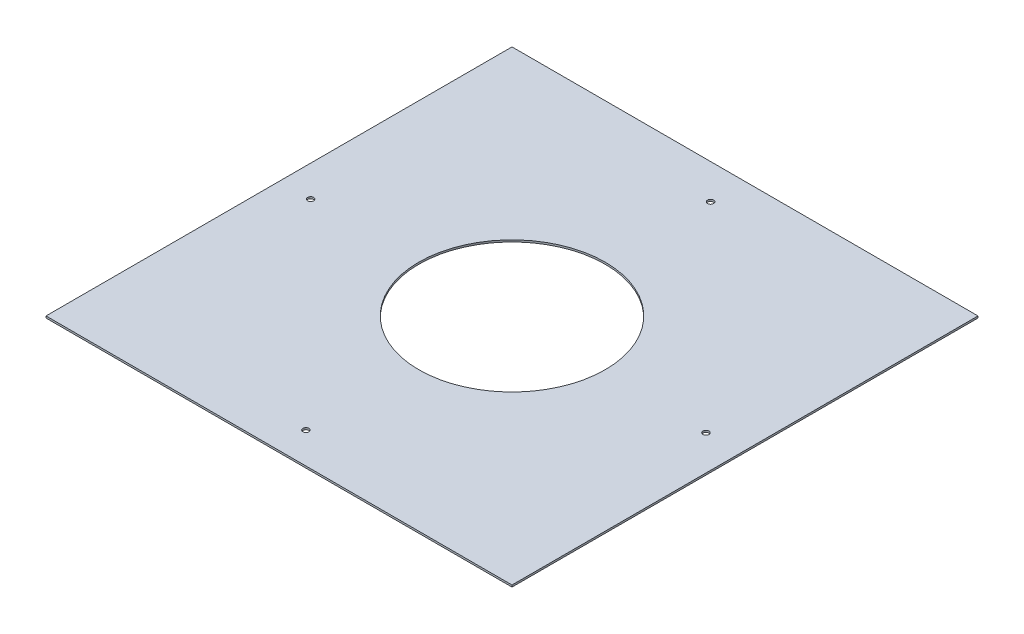
ISO-10303-21;
HEADER;
FILE_DESCRIPTION(('STEP AP214'),'2;1');
FILE_NAME('part.step','',(''),(''),'','','');
FILE_SCHEMA(('AUTOMOTIVE_DESIGN { 1 0 10303 214 1 1 1 1 }'));
ENDSEC;
DATA;
#1=APPLICATION_CONTEXT('core data for automotive mechanical design processes');
#2=APPLICATION_PROTOCOL_DEFINITION('international standard','automotive_design',2000,#1);
#3=PRODUCT_CONTEXT('',#1,'mechanical');
#4=PRODUCT('Part','Part','',(#3));
#5=PRODUCT_RELATED_PRODUCT_CATEGORY('part','',(#4));
#6=PRODUCT_DEFINITION_FORMATION('','',#4);
#7=PRODUCT_DEFINITION_CONTEXT('part definition',#1,'design');
#8=PRODUCT_DEFINITION('design','',#6,#7);
#9=PRODUCT_DEFINITION_SHAPE('','',#8);
#10=(LENGTH_UNIT() NAMED_UNIT(*) SI_UNIT(.MILLI.,.METRE.));
#11=(NAMED_UNIT(*) PLANE_ANGLE_UNIT() SI_UNIT($,.RADIAN.));
#12=(NAMED_UNIT(*) SI_UNIT($,.STERADIAN.) SOLID_ANGLE_UNIT());
#13=UNCERTAINTY_MEASURE_WITH_UNIT(LENGTH_MEASURE(1.E-05),#10,'distance_accuracy_value','');
#14=(GEOMETRIC_REPRESENTATION_CONTEXT(3) GLOBAL_UNCERTAINTY_ASSIGNED_CONTEXT((#13)) GLOBAL_UNIT_ASSIGNED_CONTEXT((#10,
#11,#12)) REPRESENTATION_CONTEXT('',''));
#15=CARTESIAN_POINT('',(0.,0.,0.));
#16=DIRECTION('',(0.,0.,1.));
#17=DIRECTION('',(1.,0.,0.));
#18=AXIS2_PLACEMENT_3D('',#15,#16,#17);
#19=CARTESIAN_POINT('',(0.,2.,0.));
#20=DIRECTION('',(0.,-1.,0.));
#21=DIRECTION('',(0.,0.,-1.));
#22=AXIS2_PLACEMENT_3D('',#19,#20,#21);
#23=PLANE('',#22);
#24=CARTESIAN_POINT('',(245.499999999996,2.,-33.3999999999985));
#25=DIRECTION('',(0.,1.,0.));
#26=DIRECTION('',(0.,0.,1.));
#27=AXIS2_PLACEMENT_3D('',#24,#25,#26);
#28=CIRCLE('',#27,3.25000000000001);
#29=CARTESIAN_POINT('',(245.499999999996,2.,-30.1499999999985));
#30=VERTEX_POINT('',#29);
#31=EDGE_CURVE('E137',#30,#30,#28,.T.);
#32=ORIENTED_EDGE('',*,*,#31,.F.);
#33=EDGE_LOOP('',(#32));
#34=FACE_BOUND('',#33,.T.);
#35=CARTESIAN_POINT('',(33.3999999999987,2.,-250.499999999998));
#36=DIRECTION('',(0.,1.,0.));
#37=DIRECTION('',(0.,0.,1.));
#38=AXIS2_PLACEMENT_3D('',#35,#36,#37);
#39=CIRCLE('',#38,3.24999999999999);
#40=CARTESIAN_POINT('',(33.3999999999987,2.,-247.249999999998));
#41=VERTEX_POINT('',#40);
#42=EDGE_CURVE('E168',#41,#41,#39,.T.);
#43=ORIENTED_EDGE('',*,*,#42,.F.);
#44=EDGE_LOOP('',(#43));
#45=FACE_BOUND('',#44,.T.);
#46=CARTESIAN_POINT('',(462.599999999999,2.,-245.499999999999));
#47=DIRECTION('',(0.,1.,0.));
#48=DIRECTION('',(0.,0.,1.));
#49=AXIS2_PLACEMENT_3D('',#46,#47,#48);
#50=CIRCLE('',#49,3.24999999999995);
#51=CARTESIAN_POINT('',(462.599999999999,2.,-242.249999999999));
#52=VERTEX_POINT('',#51);
#53=EDGE_CURVE('E164',#52,#52,#50,.T.);
#54=ORIENTED_EDGE('',*,*,#53,.F.);
#55=EDGE_LOOP('',(#54));
#56=FACE_BOUND('',#55,.T.);
#57=CARTESIAN_POINT('',(250.499999999999,2.,-462.599999999998));
#58=DIRECTION('',(0.,1.,0.));
#59=DIRECTION('',(0.,0.,1.));
#60=AXIS2_PLACEMENT_3D('',#57,#58,#59);
#61=CIRCLE('',#60,3.24999999999995);
#62=CARTESIAN_POINT('',(250.499999999999,2.,-459.349999999998));
#63=VERTEX_POINT('',#62);
#64=EDGE_CURVE('E160',#63,#63,#61,.T.);
#65=ORIENTED_EDGE('',*,*,#64,.F.);
#66=EDGE_LOOP('',(#65));
#67=FACE_BOUND('',#66,.T.);
#68=DIRECTION('',(0.,0.,1.));
#69=VECTOR('',#68,1.);
#70=CARTESIAN_POINT('',(0.,2.,0.));
#71=LINE('',#70,#69);
#72=CARTESIAN_POINT('',(0.,2.,-500.));
#73=VERTEX_POINT('',#72);
#74=CARTESIAN_POINT('',(0.,2.,0.));
#75=VERTEX_POINT('',#74);
#76=EDGE_CURVE('E100',#73,#75,#71,.T.);
#77=ORIENTED_EDGE('',*,*,#76,.T.);
#78=DIRECTION('',(1.,0.,0.));
#79=VECTOR('',#78,1.);
#80=CARTESIAN_POINT('',(0.,2.,0.));
#81=LINE('',#80,#79);
#82=CARTESIAN_POINT('',(500.,2.,0.));
#83=VERTEX_POINT('',#82);
#84=EDGE_CURVE('E95',#75,#83,#81,.T.);
#85=ORIENTED_EDGE('',*,*,#84,.T.);
#86=DIRECTION('',(0.,0.,-1.));
#87=VECTOR('',#86,1.);
#88=CARTESIAN_POINT('',(500.,2.,0.));
#89=LINE('',#88,#87);
#90=CARTESIAN_POINT('',(500.,2.,-500.));
#91=VERTEX_POINT('',#90);
#92=EDGE_CURVE('E98',#83,#91,#89,.T.);
#93=ORIENTED_EDGE('',*,*,#92,.T.);
#94=DIRECTION('',(-1.,0.,0.));
#95=VECTOR('',#94,1.);
#96=CARTESIAN_POINT('',(0.,2.,-500.));
#97=LINE('',#96,#95);
#98=EDGE_CURVE('E65',#91,#73,#97,.T.);
#99=ORIENTED_EDGE('',*,*,#98,.T.);
#100=EDGE_LOOP('',(#77,#85,#93,#99));
#101=FACE_BOUND('',#100,.T.);
#102=CARTESIAN_POINT('',(250.,2.,-250.));
#103=DIRECTION('',(0.,1.,0.));
#104=DIRECTION('',(0.,0.,1.));
#105=AXIS2_PLACEMENT_3D('',#102,#103,#104);
#106=CIRCLE('',#105,100.);
#107=CARTESIAN_POINT('',(250.,2.,-150.));
#108=VERTEX_POINT('',#107);
#109=EDGE_CURVE('E121',#108,#108,#106,.T.);
#110=ORIENTED_EDGE('',*,*,#109,.F.);
#111=EDGE_LOOP('',(#110));
#112=FACE_BOUND('',#111,.T.);
#113=ADVANCED_FACE('F45',(#34,#45,#56,#67,#101,#112),#23,.F.);
#114=CARTESIAN_POINT('',(0.,0.,0.));
#115=DIRECTION('',(0.,-1.,0.));
#116=DIRECTION('',(0.,0.,-1.));
#117=AXIS2_PLACEMENT_3D('',#114,#115,#116);
#118=PLANE('',#117);
#119=CARTESIAN_POINT('',(245.499999999996,0.,-33.3999999999985));
#120=DIRECTION('',(0.,-1.,0.));
#121=DIRECTION('',(0.,0.,-1.));
#122=AXIS2_PLACEMENT_3D('',#119,#120,#121);
#123=CIRCLE('',#122,3.25000000000001);
#124=CARTESIAN_POINT('',(245.499999999996,0.,-36.6499999999985));
#125=VERTEX_POINT('',#124);
#126=EDGE_CURVE('E49',#125,#125,#123,.T.);
#127=ORIENTED_EDGE('',*,*,#126,.F.);
#128=EDGE_LOOP('',(#127));
#129=FACE_BOUND('',#128,.T.);
#130=CARTESIAN_POINT('',(33.3999999999987,0.,-250.499999999998));
#131=DIRECTION('',(0.,-1.,0.));
#132=DIRECTION('',(0.,0.,-1.));
#133=AXIS2_PLACEMENT_3D('',#130,#131,#132);
#134=CIRCLE('',#133,3.24999999999999);
#135=CARTESIAN_POINT('',(33.3999999999987,0.,-253.749999999998));
#136=VERTEX_POINT('',#135);
#137=EDGE_CURVE('E140',#136,#136,#134,.T.);
#138=ORIENTED_EDGE('',*,*,#137,.F.);
#139=EDGE_LOOP('',(#138));
#140=FACE_BOUND('',#139,.T.);
#141=CARTESIAN_POINT('',(462.599999999999,0.,-245.499999999999));
#142=DIRECTION('',(0.,-1.,0.));
#143=DIRECTION('',(0.,0.,-1.));
#144=AXIS2_PLACEMENT_3D('',#141,#142,#143);
#145=CIRCLE('',#144,3.24999999999995);
#146=CARTESIAN_POINT('',(462.599999999999,0.,-248.749999999998));
#147=VERTEX_POINT('',#146);
#148=EDGE_CURVE('E136',#147,#147,#145,.T.);
#149=ORIENTED_EDGE('',*,*,#148,.F.);
#150=EDGE_LOOP('',(#149));
#151=FACE_BOUND('',#150,.T.);
#152=CARTESIAN_POINT('',(250.499999999999,0.,-462.599999999998));
#153=DIRECTION('',(0.,-1.,0.));
#154=DIRECTION('',(0.,0.,-1.));
#155=AXIS2_PLACEMENT_3D('',#152,#153,#154);
#156=CIRCLE('',#155,3.24999999999995);
#157=CARTESIAN_POINT('',(250.499999999999,0.,-465.849999999998));
#158=VERTEX_POINT('',#157);
#159=EDGE_CURVE('E132',#158,#158,#156,.T.);
#160=ORIENTED_EDGE('',*,*,#159,.F.);
#161=EDGE_LOOP('',(#160));
#162=FACE_BOUND('',#161,.T.);
#163=DIRECTION('',(0.,0.,1.));
#164=VECTOR('',#163,1.);
#165=CARTESIAN_POINT('',(0.,0.,0.));
#166=LINE('',#165,#164);
#167=CARTESIAN_POINT('',(0.,0.,-500.));
#168=VERTEX_POINT('',#167);
#169=CARTESIAN_POINT('',(0.,0.,0.));
#170=VERTEX_POINT('',#169);
#171=EDGE_CURVE('E117',#168,#170,#166,.T.);
#172=ORIENTED_EDGE('',*,*,#171,.F.);
#173=DIRECTION('',(-1.,0.,0.));
#174=VECTOR('',#173,1.);
#175=CARTESIAN_POINT('',(0.,0.,-500.));
#176=LINE('',#175,#174);
#177=CARTESIAN_POINT('',(500.,0.,-500.));
#178=VERTEX_POINT('',#177);
#179=EDGE_CURVE('E88',#178,#168,#176,.T.);
#180=ORIENTED_EDGE('',*,*,#179,.F.);
#181=DIRECTION('',(0.,0.,-1.));
#182=VECTOR('',#181,1.);
#183=CARTESIAN_POINT('',(500.,0.,0.));
#184=LINE('',#183,#182);
#185=CARTESIAN_POINT('',(500.,0.,0.));
#186=VERTEX_POINT('',#185);
#187=EDGE_CURVE('E82',#186,#178,#184,.T.);
#188=ORIENTED_EDGE('',*,*,#187,.F.);
#189=DIRECTION('',(1.,0.,0.));
#190=VECTOR('',#189,1.);
#191=CARTESIAN_POINT('',(0.,0.,0.));
#192=LINE('',#191,#190);
#193=EDGE_CURVE('E105',#170,#186,#192,.T.);
#194=ORIENTED_EDGE('',*,*,#193,.F.);
#195=EDGE_LOOP('',(#172,#180,#188,#194));
#196=FACE_BOUND('',#195,.T.);
#197=CARTESIAN_POINT('',(250.,0.,-250.));
#198=DIRECTION('',(0.,1.,0.));
#199=DIRECTION('',(0.,0.,1.));
#200=AXIS2_PLACEMENT_3D('',#197,#198,#199);
#201=CIRCLE('',#200,100.);
#202=CARTESIAN_POINT('',(250.,0.,-150.));
#203=VERTEX_POINT('',#202);
#204=EDGE_CURVE('E147',#203,#203,#201,.T.);
#205=ORIENTED_EDGE('',*,*,#204,.T.);
#206=EDGE_LOOP('',(#205));
#207=FACE_BOUND('',#206,.T.);
#208=ADVANCED_FACE('F180',(#129,#140,#151,#162,#196,#207),#118,.T.);
#209=CARTESIAN_POINT('',(0.,2.,0.));
#210=DIRECTION('',(1.,0.,0.));
#211=DIRECTION('',(0.,0.,-1.));
#212=AXIS2_PLACEMENT_3D('',#209,#210,#211);
#213=PLANE('',#212);
#214=ORIENTED_EDGE('',*,*,#171,.T.);
#215=DIRECTION('',(0.,-1.,0.));
#216=VECTOR('',#215,1.);
#217=CARTESIAN_POINT('',(0.,2.,0.));
#218=LINE('',#217,#216);
#219=EDGE_CURVE('E11',#75,#170,#218,.T.);
#220=ORIENTED_EDGE('',*,*,#219,.F.);
#221=ORIENTED_EDGE('',*,*,#76,.F.);
#222=DIRECTION('',(0.,-1.,0.));
#223=VECTOR('',#222,1.);
#224=CARTESIAN_POINT('',(0.,2.,-500.));
#225=LINE('',#224,#223);
#226=EDGE_CURVE('E113',#73,#168,#225,.T.);
#227=ORIENTED_EDGE('',*,*,#226,.T.);
#228=EDGE_LOOP('',(#214,#220,#221,#227));
#229=FACE_BOUND('',#228,.T.);
#230=ADVANCED_FACE('F47',(#229),#213,.F.);
#231=CARTESIAN_POINT('',(0.,2.,0.));
#232=DIRECTION('',(0.,0.,-1.));
#233=DIRECTION('',(-1.,0.,0.));
#234=AXIS2_PLACEMENT_3D('',#231,#232,#233);
#235=PLANE('',#234);
#236=ORIENTED_EDGE('',*,*,#193,.T.);
#237=DIRECTION('',(0.,-1.,0.));
#238=VECTOR('',#237,1.);
#239=CARTESIAN_POINT('',(500.,2.,0.));
#240=LINE('',#239,#238);
#241=EDGE_CURVE('E56',#83,#186,#240,.T.);
#242=ORIENTED_EDGE('',*,*,#241,.F.);
#243=ORIENTED_EDGE('',*,*,#84,.F.);
#244=ORIENTED_EDGE('',*,*,#219,.T.);
#245=EDGE_LOOP('',(#236,#242,#243,#244));
#246=FACE_BOUND('',#245,.T.);
#247=ADVANCED_FACE('F104',(#246),#235,.F.);
#248=CARTESIAN_POINT('',(500.,2.,0.));
#249=DIRECTION('',(-1.,0.,0.));
#250=DIRECTION('',(0.,0.,1.));
#251=AXIS2_PLACEMENT_3D('',#248,#249,#250);
#252=PLANE('',#251);
#253=ORIENTED_EDGE('',*,*,#187,.T.);
#254=DIRECTION('',(0.,-1.,0.));
#255=VECTOR('',#254,1.);
#256=CARTESIAN_POINT('',(500.,2.,-500.));
#257=LINE('',#256,#255);
#258=EDGE_CURVE('E107',#91,#178,#257,.T.);
#259=ORIENTED_EDGE('',*,*,#258,.F.);
#260=ORIENTED_EDGE('',*,*,#92,.F.);
#261=ORIENTED_EDGE('',*,*,#241,.T.);
#262=EDGE_LOOP('',(#253,#259,#260,#261));
#263=FACE_BOUND('',#262,.T.);
#264=ADVANCED_FACE('F109',(#263),#252,.F.);
#265=CARTESIAN_POINT('',(0.,2.,-500.));
#266=DIRECTION('',(0.,0.,1.));
#267=DIRECTION('',(1.,0.,0.));
#268=AXIS2_PLACEMENT_3D('',#265,#266,#267);
#269=PLANE('',#268);
#270=ORIENTED_EDGE('',*,*,#179,.T.);
#271=ORIENTED_EDGE('',*,*,#226,.F.);
#272=ORIENTED_EDGE('',*,*,#98,.F.);
#273=ORIENTED_EDGE('',*,*,#258,.T.);
#274=EDGE_LOOP('',(#270,#271,#272,#273));
#275=FACE_BOUND('',#274,.T.);
#276=ADVANCED_FACE('F202',(#275),#269,.F.);
#277=CARTESIAN_POINT('',(250.,2.,-250.));
#278=DIRECTION('',(0.,-1.,0.));
#279=DIRECTION('',(0.,0.,-1.));
#280=AXIS2_PLACEMENT_3D('',#277,#278,#279);
#281=CYLINDRICAL_SURFACE('',#280,100.);
#282=ORIENTED_EDGE('',*,*,#109,.T.);
#283=EDGE_LOOP('',(#282));
#284=FACE_BOUND('',#283,.T.);
#285=ORIENTED_EDGE('',*,*,#204,.F.);
#286=EDGE_LOOP('',(#285));
#287=FACE_BOUND('',#286,.T.);
#288=ADVANCED_FACE('F191',(#284,#287),#281,.F.);
#289=CARTESIAN_POINT('',(250.499999999999,-8.,-462.599999999998));
#290=DIRECTION('',(0.,1.,0.));
#291=DIRECTION('',(0.,0.,1.));
#292=AXIS2_PLACEMENT_3D('',#289,#290,#291);
#293=CYLINDRICAL_SURFACE('',#292,3.24999999999995);
#294=ORIENTED_EDGE('',*,*,#159,.T.);
#295=EDGE_LOOP('',(#294));
#296=FACE_BOUND('',#295,.T.);
#297=ORIENTED_EDGE('',*,*,#64,.T.);
#298=EDGE_LOOP('',(#297));
#299=FACE_BOUND('',#298,.T.);
#300=ADVANCED_FACE('F188',(#296,#299),#293,.F.);
#301=CARTESIAN_POINT('',(462.599999999999,-8.,-245.499999999999));
#302=DIRECTION('',(0.,1.,0.));
#303=DIRECTION('',(0.,0.,1.));
#304=AXIS2_PLACEMENT_3D('',#301,#302,#303);
#305=CYLINDRICAL_SURFACE('',#304,3.24999999999995);
#306=ORIENTED_EDGE('',*,*,#148,.T.);
#307=EDGE_LOOP('',(#306));
#308=FACE_BOUND('',#307,.T.);
#309=ORIENTED_EDGE('',*,*,#53,.T.);
#310=EDGE_LOOP('',(#309));
#311=FACE_BOUND('',#310,.T.);
#312=ADVANCED_FACE('F190',(#308,#311),#305,.F.);
#313=CARTESIAN_POINT('',(33.3999999999987,-8.,-250.499999999998));
#314=DIRECTION('',(0.,1.,0.));
#315=DIRECTION('',(0.,0.,1.));
#316=AXIS2_PLACEMENT_3D('',#313,#314,#315);
#317=CYLINDRICAL_SURFACE('',#316,3.24999999999999);
#318=ORIENTED_EDGE('',*,*,#137,.T.);
#319=EDGE_LOOP('',(#318));
#320=FACE_BOUND('',#319,.T.);
#321=ORIENTED_EDGE('',*,*,#42,.T.);
#322=EDGE_LOOP('',(#321));
#323=FACE_BOUND('',#322,.T.);
#324=ADVANCED_FACE('F198',(#320,#323),#317,.F.);
#325=CARTESIAN_POINT('',(245.499999999996,-8.,-33.3999999999985));
#326=DIRECTION('',(0.,1.,0.));
#327=DIRECTION('',(0.,0.,1.));
#328=AXIS2_PLACEMENT_3D('',#325,#326,#327);
#329=CYLINDRICAL_SURFACE('',#328,3.25000000000001);
#330=ORIENTED_EDGE('',*,*,#126,.T.);
#331=EDGE_LOOP('',(#330));
#332=FACE_BOUND('',#331,.T.);
#333=ORIENTED_EDGE('',*,*,#31,.T.);
#334=EDGE_LOOP('',(#333));
#335=FACE_BOUND('',#334,.T.);
#336=ADVANCED_FACE('F176',(#332,#335),#329,.F.);
#337=CLOSED_SHELL('',(#113,#208,#230,#247,#264,#276,#288,#300,#312,#324,#336));
#338=MANIFOLD_SOLID_BREP('B2',#337);
#339=ADVANCED_BREP_SHAPE_REPRESENTATION('',(#18,#338),#14);
#340=SHAPE_DEFINITION_REPRESENTATION(#9,#339);
ENDSEC;
END-ISO-10303-21;
